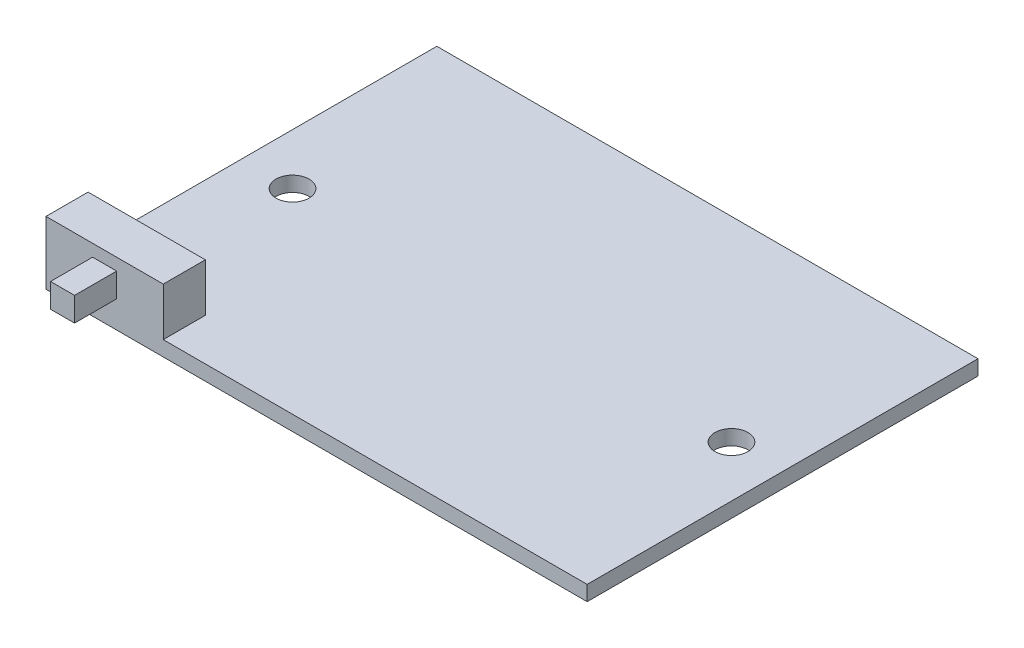
ISO-10303-21;
HEADER;
FILE_DESCRIPTION(('STEP AP214'),'2;1');
FILE_NAME('part.step','',(''),(''),'','','');
FILE_SCHEMA(('AUTOMOTIVE_DESIGN { 1 0 10303 214 1 1 1 1 }'));
ENDSEC;
DATA;
#1=APPLICATION_CONTEXT('core data for automotive mechanical design processes');
#2=APPLICATION_PROTOCOL_DEFINITION('international standard','automotive_design',2000,#1);
#3=PRODUCT_CONTEXT('',#1,'mechanical');
#4=PRODUCT('Part','Part','',(#3));
#5=PRODUCT_RELATED_PRODUCT_CATEGORY('part','',(#4));
#6=PRODUCT_DEFINITION_FORMATION('','',#4);
#7=PRODUCT_DEFINITION_CONTEXT('part definition',#1,'design');
#8=PRODUCT_DEFINITION('design','',#6,#7);
#9=PRODUCT_DEFINITION_SHAPE('','',#8);
#10=(LENGTH_UNIT() NAMED_UNIT(*) SI_UNIT(.MILLI.,.METRE.));
#11=(NAMED_UNIT(*) PLANE_ANGLE_UNIT() SI_UNIT($,.RADIAN.));
#12=(NAMED_UNIT(*) SI_UNIT($,.STERADIAN.) SOLID_ANGLE_UNIT());
#13=UNCERTAINTY_MEASURE_WITH_UNIT(LENGTH_MEASURE(1.E-05),#10,'distance_accuracy_value','');
#14=(GEOMETRIC_REPRESENTATION_CONTEXT(3) GLOBAL_UNCERTAINTY_ASSIGNED_CONTEXT((#13)) GLOBAL_UNIT_ASSIGNED_CONTEXT((#10,
#11,#12)) REPRESENTATION_CONTEXT('',''));
#15=CARTESIAN_POINT('',(0.,0.,0.));
#16=DIRECTION('',(0.,0.,1.));
#17=DIRECTION('',(1.,0.,0.));
#18=AXIS2_PLACEMENT_3D('',#15,#16,#17);
#19=CARTESIAN_POINT('',(-22.86,1.27,16.51));
#20=DIRECTION('',(0.,0.,-1.));
#21=DIRECTION('',(-1.,0.,0.));
#22=AXIS2_PLACEMENT_3D('',#19,#20,#21);
#23=PLANE('',#22);
#24=DIRECTION('',(1.,0.,0.));
#25=VECTOR('',#24,1.);
#26=CARTESIAN_POINT('',(-22.86,0.,16.51));
#27=LINE('',#26,#25);
#28=CARTESIAN_POINT('',(-22.86,0.,16.51));
#29=VERTEX_POINT('',#28);
#30=CARTESIAN_POINT('',(22.86,0.,16.51));
#31=VERTEX_POINT('',#30);
#32=EDGE_CURVE('E183',#29,#31,#27,.T.);
#33=ORIENTED_EDGE('',*,*,#32,.T.);
#34=DIRECTION('',(0.,-1.,0.));
#35=VECTOR('',#34,1.);
#36=CARTESIAN_POINT('',(22.86,1.27,16.51));
#37=LINE('',#36,#35);
#38=CARTESIAN_POINT('',(22.86,1.27,16.51));
#39=VERTEX_POINT('',#38);
#40=EDGE_CURVE('E189',#39,#31,#37,.T.);
#41=ORIENTED_EDGE('',*,*,#40,.F.);
#42=DIRECTION('',(1.,0.,0.));
#43=VECTOR('',#42,1.);
#44=CARTESIAN_POINT('',(-22.86,1.27,16.51));
#45=LINE('',#44,#43);
#46=CARTESIAN_POINT('',(-12.954,1.27,16.51));
#47=VERTEX_POINT('',#46);
#48=EDGE_CURVE('E187',#47,#39,#45,.T.);
#49=ORIENTED_EDGE('',*,*,#48,.F.);
#50=DIRECTION('',(0.,-1.,0.));
#51=VECTOR('',#50,1.);
#52=CARTESIAN_POINT('',(-12.954,5.334,16.51));
#53=LINE('',#52,#51);
#54=CARTESIAN_POINT('',(-12.954,5.334,16.51));
#55=VERTEX_POINT('',#54);
#56=EDGE_CURVE('E163',#55,#47,#53,.T.);
#57=ORIENTED_EDGE('',*,*,#56,.F.);
#58=DIRECTION('',(1.,0.,0.));
#59=VECTOR('',#58,1.);
#60=CARTESIAN_POINT('',(-22.86,5.334,16.51));
#61=LINE('',#60,#59);
#62=CARTESIAN_POINT('',(-22.86,5.334,16.51));
#63=VERTEX_POINT('',#62);
#64=EDGE_CURVE('E149',#63,#55,#61,.T.);
#65=ORIENTED_EDGE('',*,*,#64,.F.);
#66=DIRECTION('',(0.,-1.,0.));
#67=VECTOR('',#66,1.);
#68=CARTESIAN_POINT('',(-22.86,1.27,16.51));
#69=LINE('',#68,#67);
#70=EDGE_CURVE('E199',#63,#29,#69,.T.);
#71=ORIENTED_EDGE('',*,*,#70,.T.);
#72=EDGE_LOOP('',(#33,#41,#49,#57,#65,#71));
#73=FACE_BOUND('',#72,.T.);
#74=DIRECTION('',(0.,-1.,0.));
#75=VECTOR('',#74,1.);
#76=CARTESIAN_POINT('',(-18.923,4.318,16.51));
#77=LINE('',#76,#75);
#78=CARTESIAN_POINT('',(-18.923,4.318,16.51));
#79=VERTEX_POINT('',#78);
#80=CARTESIAN_POINT('',(-18.923,2.286,16.51));
#81=VERTEX_POINT('',#80);
#82=EDGE_CURVE('E136',#79,#81,#77,.T.);
#83=ORIENTED_EDGE('',*,*,#82,.F.);
#84=DIRECTION('',(-1.,0.,0.));
#85=VECTOR('',#84,1.);
#86=CARTESIAN_POINT('',(-18.923,4.318,16.51));
#87=LINE('',#86,#85);
#88=CARTESIAN_POINT('',(-16.891,4.318,16.51));
#89=VERTEX_POINT('',#88);
#90=EDGE_CURVE('E133',#89,#79,#87,.T.);
#91=ORIENTED_EDGE('',*,*,#90,.F.);
#92=DIRECTION('',(0.,1.,0.));
#93=VECTOR('',#92,1.);
#94=CARTESIAN_POINT('',(-16.891,4.318,16.51));
#95=LINE('',#94,#93);
#96=CARTESIAN_POINT('',(-16.891,2.286,16.51));
#97=VERTEX_POINT('',#96);
#98=EDGE_CURVE('E53',#97,#89,#95,.T.);
#99=ORIENTED_EDGE('',*,*,#98,.F.);
#100=DIRECTION('',(1.,0.,0.));
#101=VECTOR('',#100,1.);
#102=CARTESIAN_POINT('',(-18.923,2.286,16.51));
#103=LINE('',#102,#101);
#104=EDGE_CURVE('E48',#81,#97,#103,.T.);
#105=ORIENTED_EDGE('',*,*,#104,.F.);
#106=EDGE_LOOP('',(#83,#91,#99,#105));
#107=FACE_BOUND('',#106,.T.);
#108=ADVANCED_FACE('F33',(#73,#107),#23,.F.);
#109=CARTESIAN_POINT('',(0.,1.27,0.));
#110=DIRECTION('',(0.,1.,0.));
#111=DIRECTION('',(0.,0.,1.));
#112=AXIS2_PLACEMENT_3D('',#109,#110,#111);
#113=PLANE('',#112);
#114=DIRECTION('',(-1.,0.,0.));
#115=VECTOR('',#114,1.);
#116=CARTESIAN_POINT('',(-22.86,1.27,12.954));
#117=LINE('',#116,#115);
#118=CARTESIAN_POINT('',(-12.954,1.27,12.954));
#119=VERTEX_POINT('',#118);
#120=CARTESIAN_POINT('',(-22.86,1.27,12.954));
#121=VERTEX_POINT('',#120);
#122=EDGE_CURVE('E140',#119,#121,#117,.T.);
#123=ORIENTED_EDGE('',*,*,#122,.F.);
#124=DIRECTION('',(0.,0.,-1.));
#125=VECTOR('',#124,1.);
#126=CARTESIAN_POINT('',(-12.954,1.27,12.954));
#127=LINE('',#126,#125);
#128=EDGE_CURVE('E137',#47,#119,#127,.T.);
#129=ORIENTED_EDGE('',*,*,#128,.F.);
#130=ORIENTED_EDGE('',*,*,#48,.T.);
#131=DIRECTION('',(0.,0.,-1.));
#132=VECTOR('',#131,1.);
#133=CARTESIAN_POINT('',(22.86,1.27,-16.51));
#134=LINE('',#133,#132);
#135=CARTESIAN_POINT('',(22.86,1.27,-16.51));
#136=VERTEX_POINT('',#135);
#137=EDGE_CURVE('E179',#39,#136,#134,.T.);
#138=ORIENTED_EDGE('',*,*,#137,.T.);
#139=DIRECTION('',(-1.,0.,0.));
#140=VECTOR('',#139,1.);
#141=CARTESIAN_POINT('',(-22.86,1.27,-16.51));
#142=LINE('',#141,#140);
#143=CARTESIAN_POINT('',(-22.86,1.27,-16.51));
#144=VERTEX_POINT('',#143);
#145=EDGE_CURVE('E182',#136,#144,#142,.T.);
#146=ORIENTED_EDGE('',*,*,#145,.T.);
#147=DIRECTION('',(0.,0.,1.));
#148=VECTOR('',#147,1.);
#149=CARTESIAN_POINT('',(-22.86,1.27,-16.51));
#150=LINE('',#149,#148);
#151=EDGE_CURVE('E185',#144,#121,#150,.T.);
#152=ORIENTED_EDGE('',*,*,#151,.T.);
#153=EDGE_LOOP('',(#123,#129,#130,#138,#146,#152));
#154=FACE_BOUND('',#153,.T.);
#155=CARTESIAN_POINT('',(-18.542,1.27,0.));
#156=DIRECTION('',(0.,1.,0.));
#157=DIRECTION('',(0.,0.,1.));
#158=AXIS2_PLACEMENT_3D('',#155,#156,#157);
#159=CIRCLE('',#158,1.397);
#160=CARTESIAN_POINT('',(-18.542,1.27,1.397));
#161=VERTEX_POINT('',#160);
#162=EDGE_CURVE('E173',#161,#161,#159,.T.);
#163=ORIENTED_EDGE('',*,*,#162,.F.);
#164=EDGE_LOOP('',(#163));
#165=FACE_BOUND('',#164,.T.);
#166=CARTESIAN_POINT('',(18.542,1.27,0.));
#167=DIRECTION('',(0.,1.,0.));
#168=DIRECTION('',(0.,0.,1.));
#169=AXIS2_PLACEMENT_3D('',#166,#167,#168);
#170=CIRCLE('',#169,1.397);
#171=CARTESIAN_POINT('',(18.542,1.27,1.397));
#172=VERTEX_POINT('',#171);
#173=EDGE_CURVE('E167',#172,#172,#170,.T.);
#174=ORIENTED_EDGE('',*,*,#173,.F.);
#175=EDGE_LOOP('',(#174));
#176=FACE_BOUND('',#175,.T.);
#177=ADVANCED_FACE('F221',(#154,#165,#176),#113,.T.);
#178=CARTESIAN_POINT('',(0.,0.,0.));
#179=DIRECTION('',(0.,1.,0.));
#180=DIRECTION('',(0.,0.,1.));
#181=AXIS2_PLACEMENT_3D('',#178,#179,#180);
#182=PLANE('',#181);
#183=DIRECTION('',(0.,0.,-1.));
#184=VECTOR('',#183,1.);
#185=CARTESIAN_POINT('',(22.86,0.,-16.51));
#186=LINE('',#185,#184);
#187=CARTESIAN_POINT('',(22.86,0.,-16.51));
#188=VERTEX_POINT('',#187);
#189=EDGE_CURVE('E176',#31,#188,#186,.T.);
#190=ORIENTED_EDGE('',*,*,#189,.F.);
#191=ORIENTED_EDGE('',*,*,#32,.F.);
#192=DIRECTION('',(0.,0.,1.));
#193=VECTOR('',#192,1.);
#194=CARTESIAN_POINT('',(-22.86,0.,-16.51));
#195=LINE('',#194,#193);
#196=CARTESIAN_POINT('',(-22.86,0.,-16.51));
#197=VERTEX_POINT('',#196);
#198=EDGE_CURVE('E194',#197,#29,#195,.T.);
#199=ORIENTED_EDGE('',*,*,#198,.F.);
#200=DIRECTION('',(-1.,0.,0.));
#201=VECTOR('',#200,1.);
#202=CARTESIAN_POINT('',(-22.86,0.,-16.51));
#203=LINE('',#202,#201);
#204=EDGE_CURVE('E192',#188,#197,#203,.T.);
#205=ORIENTED_EDGE('',*,*,#204,.F.);
#206=EDGE_LOOP('',(#190,#191,#199,#205));
#207=FACE_BOUND('',#206,.T.);
#208=CARTESIAN_POINT('',(-18.542,0.,0.));
#209=DIRECTION('',(0.,1.,0.));
#210=DIRECTION('',(0.,0.,1.));
#211=AXIS2_PLACEMENT_3D('',#208,#209,#210);
#212=CIRCLE('',#211,1.397);
#213=CARTESIAN_POINT('',(-18.542,0.,1.397));
#214=VERTEX_POINT('',#213);
#215=EDGE_CURVE('E170',#214,#214,#212,.T.);
#216=ORIENTED_EDGE('',*,*,#215,.T.);
#217=EDGE_LOOP('',(#216));
#218=FACE_BOUND('',#217,.T.);
#219=CARTESIAN_POINT('',(18.542,0.,0.));
#220=DIRECTION('',(0.,1.,0.));
#221=DIRECTION('',(0.,0.,1.));
#222=AXIS2_PLACEMENT_3D('',#219,#220,#221);
#223=CIRCLE('',#222,1.397);
#224=CARTESIAN_POINT('',(18.542,0.,1.397));
#225=VERTEX_POINT('',#224);
#226=EDGE_CURVE('E166',#225,#225,#223,.T.);
#227=ORIENTED_EDGE('',*,*,#226,.T.);
#228=EDGE_LOOP('',(#227));
#229=FACE_BOUND('',#228,.T.);
#230=ADVANCED_FACE('F211',(#207,#218,#229),#182,.F.);
#231=CARTESIAN_POINT('',(22.86,1.27,-16.51));
#232=DIRECTION('',(-1.,0.,0.));
#233=DIRECTION('',(0.,0.,1.));
#234=AXIS2_PLACEMENT_3D('',#231,#232,#233);
#235=PLANE('',#234);
#236=ORIENTED_EDGE('',*,*,#189,.T.);
#237=DIRECTION('',(0.,-1.,0.));
#238=VECTOR('',#237,1.);
#239=CARTESIAN_POINT('',(22.86,1.27,-16.51));
#240=LINE('',#239,#238);
#241=EDGE_CURVE('E11',#136,#188,#240,.T.);
#242=ORIENTED_EDGE('',*,*,#241,.F.);
#243=ORIENTED_EDGE('',*,*,#137,.F.);
#244=ORIENTED_EDGE('',*,*,#40,.T.);
#245=EDGE_LOOP('',(#236,#242,#243,#244));
#246=FACE_BOUND('',#245,.T.);
#247=ADVANCED_FACE('F35',(#246),#235,.F.);
#248=CARTESIAN_POINT('',(-22.86,1.27,-16.51));
#249=DIRECTION('',(0.,0.,1.));
#250=DIRECTION('',(1.,0.,0.));
#251=AXIS2_PLACEMENT_3D('',#248,#249,#250);
#252=PLANE('',#251);
#253=ORIENTED_EDGE('',*,*,#204,.T.);
#254=DIRECTION('',(0.,-1.,0.));
#255=VECTOR('',#254,1.);
#256=CARTESIAN_POINT('',(-22.86,1.27,-16.51));
#257=LINE('',#256,#255);
#258=EDGE_CURVE('E41',#144,#197,#257,.T.);
#259=ORIENTED_EDGE('',*,*,#258,.F.);
#260=ORIENTED_EDGE('',*,*,#145,.F.);
#261=ORIENTED_EDGE('',*,*,#241,.T.);
#262=EDGE_LOOP('',(#253,#259,#260,#261));
#263=FACE_BOUND('',#262,.T.);
#264=ADVANCED_FACE('F255',(#263),#252,.F.);
#265=CARTESIAN_POINT('',(-22.86,1.27,-16.51));
#266=DIRECTION('',(1.,0.,0.));
#267=DIRECTION('',(0.,0.,-1.));
#268=AXIS2_PLACEMENT_3D('',#265,#266,#267);
#269=PLANE('',#268);
#270=ORIENTED_EDGE('',*,*,#198,.T.);
#271=ORIENTED_EDGE('',*,*,#70,.F.);
#272=DIRECTION('',(0.,0.,1.));
#273=VECTOR('',#272,1.);
#274=CARTESIAN_POINT('',(-22.86,5.334,12.954));
#275=LINE('',#274,#273);
#276=CARTESIAN_POINT('',(-22.86,5.334,12.954));
#277=VERTEX_POINT('',#276);
#278=EDGE_CURVE('E146',#277,#63,#275,.T.);
#279=ORIENTED_EDGE('',*,*,#278,.F.);
#280=DIRECTION('',(0.,-1.,0.));
#281=VECTOR('',#280,1.);
#282=CARTESIAN_POINT('',(-22.86,5.334,12.954));
#283=LINE('',#282,#281);
#284=EDGE_CURVE('E154',#277,#121,#283,.T.);
#285=ORIENTED_EDGE('',*,*,#284,.T.);
#286=ORIENTED_EDGE('',*,*,#151,.F.);
#287=ORIENTED_EDGE('',*,*,#258,.T.);
#288=EDGE_LOOP('',(#270,#271,#279,#285,#286,#287));
#289=FACE_BOUND('',#288,.T.);
#290=ADVANCED_FACE('F206',(#289),#269,.F.);
#291=CARTESIAN_POINT('',(-18.542,1.27,0.));
#292=DIRECTION('',(0.,-1.,0.));
#293=DIRECTION('',(0.,0.,-1.));
#294=AXIS2_PLACEMENT_3D('',#291,#292,#293);
#295=CYLINDRICAL_SURFACE('',#294,1.397);
#296=ORIENTED_EDGE('',*,*,#162,.T.);
#297=EDGE_LOOP('',(#296));
#298=FACE_BOUND('',#297,.T.);
#299=ORIENTED_EDGE('',*,*,#215,.F.);
#300=EDGE_LOOP('',(#299));
#301=FACE_BOUND('',#300,.T.);
#302=ADVANCED_FACE('F254',(#298,#301),#295,.F.);
#303=CARTESIAN_POINT('',(18.542,1.27,0.));
#304=DIRECTION('',(0.,-1.,0.));
#305=DIRECTION('',(0.,0.,-1.));
#306=AXIS2_PLACEMENT_3D('',#303,#304,#305);
#307=CYLINDRICAL_SURFACE('',#306,1.397);
#308=ORIENTED_EDGE('',*,*,#173,.T.);
#309=EDGE_LOOP('',(#308));
#310=FACE_BOUND('',#309,.T.);
#311=ORIENTED_EDGE('',*,*,#226,.F.);
#312=EDGE_LOOP('',(#311));
#313=FACE_BOUND('',#312,.T.);
#314=ADVANCED_FACE('F242',(#310,#313),#307,.F.);
#315=CARTESIAN_POINT('',(-12.954,5.334,12.954));
#316=DIRECTION('',(-1.,0.,0.));
#317=DIRECTION('',(0.,0.,1.));
#318=AXIS2_PLACEMENT_3D('',#315,#316,#317);
#319=PLANE('',#318);
#320=ORIENTED_EDGE('',*,*,#128,.T.);
#321=DIRECTION('',(0.,-1.,0.));
#322=VECTOR('',#321,1.);
#323=CARTESIAN_POINT('',(-12.954,5.334,12.954));
#324=LINE('',#323,#322);
#325=CARTESIAN_POINT('',(-12.954,5.334,12.954));
#326=VERTEX_POINT('',#325);
#327=EDGE_CURVE('E160',#326,#119,#324,.T.);
#328=ORIENTED_EDGE('',*,*,#327,.F.);
#329=DIRECTION('',(0.,0.,-1.));
#330=VECTOR('',#329,1.);
#331=CARTESIAN_POINT('',(-12.954,5.334,12.954));
#332=LINE('',#331,#330);
#333=EDGE_CURVE('E151',#55,#326,#332,.T.);
#334=ORIENTED_EDGE('',*,*,#333,.F.);
#335=ORIENTED_EDGE('',*,*,#56,.T.);
#336=EDGE_LOOP('',(#320,#328,#334,#335));
#337=FACE_BOUND('',#336,.T.);
#338=ADVANCED_FACE('F226',(#337),#319,.F.);
#339=CARTESIAN_POINT('',(-22.86,5.334,12.954));
#340=DIRECTION('',(0.,0.,1.));
#341=DIRECTION('',(1.,0.,0.));
#342=AXIS2_PLACEMENT_3D('',#339,#340,#341);
#343=PLANE('',#342);
#344=ORIENTED_EDGE('',*,*,#122,.T.);
#345=ORIENTED_EDGE('',*,*,#284,.F.);
#346=DIRECTION('',(-1.,0.,0.));
#347=VECTOR('',#346,1.);
#348=CARTESIAN_POINT('',(-22.86,5.334,12.954));
#349=LINE('',#348,#347);
#350=EDGE_CURVE('E153',#326,#277,#349,.T.);
#351=ORIENTED_EDGE('',*,*,#350,.F.);
#352=ORIENTED_EDGE('',*,*,#327,.T.);
#353=EDGE_LOOP('',(#344,#345,#351,#352));
#354=FACE_BOUND('',#353,.T.);
#355=ADVANCED_FACE('F234',(#354),#343,.F.);
#356=CARTESIAN_POINT('',(0.,5.334,0.));
#357=DIRECTION('',(0.,1.,0.));
#358=DIRECTION('',(0.,0.,1.));
#359=AXIS2_PLACEMENT_3D('',#356,#357,#358);
#360=PLANE('',#359);
#361=ORIENTED_EDGE('',*,*,#278,.T.);
#362=ORIENTED_EDGE('',*,*,#64,.T.);
#363=ORIENTED_EDGE('',*,*,#333,.T.);
#364=ORIENTED_EDGE('',*,*,#350,.T.);
#365=EDGE_LOOP('',(#361,#362,#363,#364));
#366=FACE_BOUND('',#365,.T.);
#367=ADVANCED_FACE('F230',(#366),#360,.T.);
#368=CARTESIAN_POINT('',(-18.923,4.318,20.066));
#369=DIRECTION('',(1.,0.,0.));
#370=DIRECTION('',(0.,0.,-1.));
#371=AXIS2_PLACEMENT_3D('',#368,#369,#370);
#372=PLANE('',#371);
#373=ORIENTED_EDGE('',*,*,#82,.T.);
#374=DIRECTION('',(0.,0.,-1.));
#375=VECTOR('',#374,1.);
#376=CARTESIAN_POINT('',(-18.923,2.286,20.066));
#377=LINE('',#376,#375);
#378=CARTESIAN_POINT('',(-18.923,2.286,20.066));
#379=VERTEX_POINT('',#378);
#380=EDGE_CURVE('E117',#379,#81,#377,.T.);
#381=ORIENTED_EDGE('',*,*,#380,.F.);
#382=DIRECTION('',(0.,-1.,0.));
#383=VECTOR('',#382,1.);
#384=CARTESIAN_POINT('',(-18.923,4.318,20.066));
#385=LINE('',#384,#383);
#386=CARTESIAN_POINT('',(-18.923,4.318,20.066));
#387=VERTEX_POINT('',#386);
#388=EDGE_CURVE('E124',#387,#379,#385,.T.);
#389=ORIENTED_EDGE('',*,*,#388,.F.);
#390=DIRECTION('',(0.,0.,-1.));
#391=VECTOR('',#390,1.);
#392=CARTESIAN_POINT('',(-18.923,4.318,20.066));
#393=LINE('',#392,#391);
#394=EDGE_CURVE('E352',#387,#79,#393,.T.);
#395=ORIENTED_EDGE('',*,*,#394,.T.);
#396=EDGE_LOOP('',(#373,#381,#389,#395));
#397=FACE_BOUND('',#396,.T.);
#398=ADVANCED_FACE('F135',(#397),#372,.F.);
#399=CARTESIAN_POINT('',(-18.923,2.286,20.066));
#400=DIRECTION('',(0.,1.,0.));
#401=DIRECTION('',(0.,0.,1.));
#402=AXIS2_PLACEMENT_3D('',#399,#400,#401);
#403=PLANE('',#402);
#404=ORIENTED_EDGE('',*,*,#104,.T.);
#405=DIRECTION('',(0.,0.,-1.));
#406=VECTOR('',#405,1.);
#407=CARTESIAN_POINT('',(-16.891,2.286,20.066));
#408=LINE('',#407,#406);
#409=CARTESIAN_POINT('',(-16.891,2.286,20.066));
#410=VERTEX_POINT('',#409);
#411=EDGE_CURVE('E120',#410,#97,#408,.T.);
#412=ORIENTED_EDGE('',*,*,#411,.F.);
#413=DIRECTION('',(1.,0.,0.));
#414=VECTOR('',#413,1.);
#415=CARTESIAN_POINT('',(-18.923,2.286,20.066));
#416=LINE('',#415,#414);
#417=EDGE_CURVE('E113',#379,#410,#416,.T.);
#418=ORIENTED_EDGE('',*,*,#417,.F.);
#419=ORIENTED_EDGE('',*,*,#380,.T.);
#420=EDGE_LOOP('',(#404,#412,#418,#419));
#421=FACE_BOUND('',#420,.T.);
#422=ADVANCED_FACE('F115',(#421),#403,.F.);
#423=CARTESIAN_POINT('',(-16.891,4.318,20.066));
#424=DIRECTION('',(-1.,0.,0.));
#425=DIRECTION('',(0.,0.,1.));
#426=AXIS2_PLACEMENT_3D('',#423,#424,#425);
#427=PLANE('',#426);
#428=ORIENTED_EDGE('',*,*,#98,.T.);
#429=DIRECTION('',(0.,0.,-1.));
#430=VECTOR('',#429,1.);
#431=CARTESIAN_POINT('',(-16.891,4.318,20.066));
#432=LINE('',#431,#430);
#433=CARTESIAN_POINT('',(-16.891,4.318,20.066));
#434=VERTEX_POINT('',#433);
#435=EDGE_CURVE('E142',#434,#89,#432,.T.);
#436=ORIENTED_EDGE('',*,*,#435,.F.);
#437=DIRECTION('',(0.,1.,0.));
#438=VECTOR('',#437,1.);
#439=CARTESIAN_POINT('',(-16.891,4.318,20.066));
#440=LINE('',#439,#438);
#441=EDGE_CURVE('E123',#410,#434,#440,.T.);
#442=ORIENTED_EDGE('',*,*,#441,.F.);
#443=ORIENTED_EDGE('',*,*,#411,.T.);
#444=EDGE_LOOP('',(#428,#436,#442,#443));
#445=FACE_BOUND('',#444,.T.);
#446=ADVANCED_FACE('F319',(#445),#427,.F.);
#447=CARTESIAN_POINT('',(-18.923,4.318,20.066));
#448=DIRECTION('',(0.,-1.,0.));
#449=DIRECTION('',(0.,0.,-1.));
#450=AXIS2_PLACEMENT_3D('',#447,#448,#449);
#451=PLANE('',#450);
#452=ORIENTED_EDGE('',*,*,#90,.T.);
#453=ORIENTED_EDGE('',*,*,#394,.F.);
#454=DIRECTION('',(-1.,0.,0.));
#455=VECTOR('',#454,1.);
#456=CARTESIAN_POINT('',(-18.923,4.318,20.066));
#457=LINE('',#456,#455);
#458=EDGE_CURVE('E129',#434,#387,#457,.T.);
#459=ORIENTED_EDGE('',*,*,#458,.F.);
#460=ORIENTED_EDGE('',*,*,#435,.T.);
#461=EDGE_LOOP('',(#452,#453,#459,#460));
#462=FACE_BOUND('',#461,.T.);
#463=ADVANCED_FACE('F328',(#462),#451,.F.);
#464=CARTESIAN_POINT('',(0.,0.,20.066));
#465=DIRECTION('',(0.,0.,1.));
#466=DIRECTION('',(1.,0.,0.));
#467=AXIS2_PLACEMENT_3D('',#464,#465,#466);
#468=PLANE('',#467);
#469=ORIENTED_EDGE('',*,*,#388,.T.);
#470=ORIENTED_EDGE('',*,*,#417,.T.);
#471=ORIENTED_EDGE('',*,*,#441,.T.);
#472=ORIENTED_EDGE('',*,*,#458,.T.);
#473=EDGE_LOOP('',(#469,#470,#471,#472));
#474=FACE_BOUND('',#473,.T.);
#475=ADVANCED_FACE('F127',(#474),#468,.T.);
#476=CLOSED_SHELL('',(#108,#177,#230,#247,#264,#290,#302,#314,#338,#355,#367,#398,#422,#446,
#463,#475));
#477=MANIFOLD_SOLID_BREP('B2',#476);
#478=ADVANCED_BREP_SHAPE_REPRESENTATION('',(#18,#477),#14);
#479=SHAPE_DEFINITION_REPRESENTATION(#9,#478);
ENDSEC;
END-ISO-10303-21;
